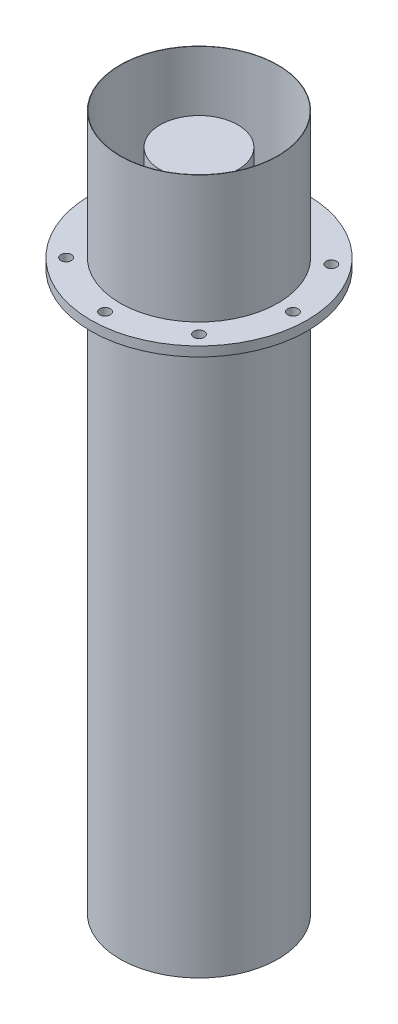
ISO-10303-21;
HEADER;
FILE_DESCRIPTION(('STEP AP214'),'2;1');
FILE_NAME('part.step','',(''),(''),'','','');
FILE_SCHEMA(('AUTOMOTIVE_DESIGN { 1 0 10303 214 1 1 1 1 }'));
ENDSEC;
DATA;
#1=APPLICATION_CONTEXT('core data for automotive mechanical design processes');
#2=APPLICATION_PROTOCOL_DEFINITION('international standard','automotive_design',2000,#1);
#3=PRODUCT_CONTEXT('',#1,'mechanical');
#4=PRODUCT('Part','Part','',(#3));
#5=PRODUCT_RELATED_PRODUCT_CATEGORY('part','',(#4));
#6=PRODUCT_DEFINITION_FORMATION('','',#4);
#7=PRODUCT_DEFINITION_CONTEXT('part definition',#1,'design');
#8=PRODUCT_DEFINITION('design','',#6,#7);
#9=PRODUCT_DEFINITION_SHAPE('','',#8);
#10=(LENGTH_UNIT() NAMED_UNIT(*) SI_UNIT(.MILLI.,.METRE.));
#11=(NAMED_UNIT(*) PLANE_ANGLE_UNIT() SI_UNIT($,.RADIAN.));
#12=(NAMED_UNIT(*) SI_UNIT($,.STERADIAN.) SOLID_ANGLE_UNIT());
#13=UNCERTAINTY_MEASURE_WITH_UNIT(LENGTH_MEASURE(1.E-05),#10,'distance_accuracy_value','');
#14=(GEOMETRIC_REPRESENTATION_CONTEXT(3) GLOBAL_UNCERTAINTY_ASSIGNED_CONTEXT((#13)) GLOBAL_UNIT_ASSIGNED_CONTEXT((#10,
#11,#12)) REPRESENTATION_CONTEXT('',''));
#15=CARTESIAN_POINT('',(0.,0.,0.));
#16=DIRECTION('',(0.,0.,1.));
#17=DIRECTION('',(1.,0.,0.));
#18=AXIS2_PLACEMENT_3D('',#15,#16,#17);
#19=CARTESIAN_POINT('',(0.,-81.6,0.));
#20=DIRECTION('',(0.,1.,0.));
#21=DIRECTION('',(0.,0.,1.));
#22=AXIS2_PLACEMENT_3D('',#19,#20,#21);
#23=CYLINDRICAL_SURFACE('',#22,22.5);
#24=CARTESIAN_POINT('',(0.,0.,0.));
#25=DIRECTION('',(0.,1.,0.));
#26=DIRECTION('',(0.,0.,1.));
#27=AXIS2_PLACEMENT_3D('',#24,#25,#26);
#28=CIRCLE('',#27,22.5);
#29=CARTESIAN_POINT('',(0.,0.,22.5));
#30=VERTEX_POINT('',#29);
#31=EDGE_CURVE('E12',#30,#30,#28,.T.);
#32=ORIENTED_EDGE('',*,*,#31,.T.);
#33=EDGE_LOOP('',(#32));
#34=FACE_BOUND('',#33,.T.);
#35=CARTESIAN_POINT('',(0.,175.4,0.));
#36=DIRECTION('',(0.,1.,0.));
#37=DIRECTION('',(0.,0.,1.));
#38=AXIS2_PLACEMENT_3D('',#35,#36,#37);
#39=CIRCLE('',#38,22.5);
#40=CARTESIAN_POINT('',(0.,175.4,22.5));
#41=VERTEX_POINT('',#40);
#42=EDGE_CURVE('E57',#41,#41,#39,.F.);
#43=ORIENTED_EDGE('',*,*,#42,.T.);
#44=EDGE_LOOP('',(#43));
#45=FACE_BOUND('',#44,.T.);
#46=ADVANCED_FACE('F53',(#34,#45),#23,.T.);
#47=CARTESIAN_POINT('',(0.,0.,0.));
#48=DIRECTION('',(0.,1.,0.));
#49=DIRECTION('',(0.,0.,1.));
#50=AXIS2_PLACEMENT_3D('',#47,#48,#49);
#51=PLANE('',#50);
#52=DIRECTION('',(-0.999986644437451,0.,-0.00516826341502603));
#53=VECTOR('',#52,1.);
#54=CARTESIAN_POINT('',(3.54748062860919,0.,6.21841736481043));
#55=LINE('',#54,#53);
#56=CARTESIAN_POINT('',(3.54748062860919,0.,6.21841736481042));
#57=VERTEX_POINT('',#56);
#58=CARTESIAN_POINT('',(-3.61156709495552,0.,6.18141702621396));
#59=VERTEX_POINT('',#58);
#60=EDGE_CURVE('E123',#57,#59,#55,.T.);
#61=ORIENTED_EDGE('',*,*,#60,.F.);
#62=DIRECTION('',(-0.504469169629588,0.,0.863429705820476));
#63=VECTOR('',#62,1.);
#64=CARTESIAN_POINT('',(7.15904772356471,0.,0.0370003385964624));
#65=LINE('',#64,#63);
#66=CARTESIAN_POINT('',(7.15904772356471,0.,0.0370003385964624));
#67=VERTEX_POINT('',#66);
#68=EDGE_CURVE('E160',#67,#57,#65,.T.);
#69=ORIENTED_EDGE('',*,*,#68,.F.);
#70=DIRECTION('',(0.495517474807863,0.,0.868597969235502));
#71=VECTOR('',#70,1.);
#72=CARTESIAN_POINT('',(3.61156709495552,0.,-6.18141702621396));
#73=LINE('',#72,#71);
#74=CARTESIAN_POINT('',(3.61156709495552,0.,-6.18141702621396));
#75=VERTEX_POINT('',#74);
#76=EDGE_CURVE('E181',#75,#67,#73,.T.);
#77=ORIENTED_EDGE('',*,*,#76,.F.);
#78=DIRECTION('',(0.999986644437451,0.,0.00516826341502615));
#79=VECTOR('',#78,1.);
#80=CARTESIAN_POINT('',(-3.54748062860919,0.,-6.21841736481043));
#81=LINE('',#80,#79);
#82=CARTESIAN_POINT('',(-3.54748062860919,0.,-6.21841736481043));
#83=VERTEX_POINT('',#82);
#84=EDGE_CURVE('E176',#83,#75,#81,.T.);
#85=ORIENTED_EDGE('',*,*,#84,.F.);
#86=DIRECTION('',(0.504469169629588,0.,-0.863429705820476));
#87=VECTOR('',#86,1.);
#88=CARTESIAN_POINT('',(-7.15904772356471,0.,-0.0370003385964647));
#89=LINE('',#88,#87);
#90=CARTESIAN_POINT('',(-7.15904772356471,0.,-0.0370003385964647));
#91=VERTEX_POINT('',#90);
#92=EDGE_CURVE('E171',#91,#83,#89,.T.);
#93=ORIENTED_EDGE('',*,*,#92,.F.);
#94=DIRECTION('',(-0.495517474807863,0.,-0.868597969235503));
#95=VECTOR('',#94,1.);
#96=CARTESIAN_POINT('',(-3.61156709495552,0.,6.18141702621396));
#97=LINE('',#96,#95);
#98=EDGE_CURVE('E128',#59,#91,#97,.T.);
#99=ORIENTED_EDGE('',*,*,#98,.F.);
#100=EDGE_LOOP('',(#61,#69,#77,#85,#93,#99));
#101=FACE_BOUND('',#100,.T.);
#102=ORIENTED_EDGE('',*,*,#31,.F.);
#103=EDGE_LOOP('',(#102));
#104=FACE_BOUND('',#103,.T.);
#105=ADVANCED_FACE('F55',(#101,#104),#51,.F.);
#106=CARTESIAN_POINT('',(0.,8.,0.));
#107=DIRECTION('',(0.,-1.,0.));
#108=DIRECTION('',(0.,0.,-1.));
#109=AXIS2_PLACEMENT_3D('',#106,#107,#108);
#110=PLANE('',#109);
#111=DIRECTION('',(-0.504469169629588,0.,0.863429705820476));
#112=VECTOR('',#111,1.);
#113=CARTESIAN_POINT('',(7.15904772356471,8.,0.0370003385964624));
#114=LINE('',#113,#112);
#115=CARTESIAN_POINT('',(7.15904772356471,8.,0.0370003385964624));
#116=VERTEX_POINT('',#115);
#117=CARTESIAN_POINT('',(3.54748062860919,8.,6.21841736481043));
#118=VERTEX_POINT('',#117);
#119=EDGE_CURVE('E144',#116,#118,#114,.T.);
#120=ORIENTED_EDGE('',*,*,#119,.T.);
#121=DIRECTION('',(-0.999986644437451,0.,-0.00516826341502603));
#122=VECTOR('',#121,1.);
#123=CARTESIAN_POINT('',(3.54748062860919,8.,6.21841736481043));
#124=LINE('',#123,#122);
#125=CARTESIAN_POINT('',(-3.61156709495552,8.,6.18141702621396));
#126=VERTEX_POINT('',#125);
#127=EDGE_CURVE('E120',#118,#126,#124,.T.);
#128=ORIENTED_EDGE('',*,*,#127,.T.);
#129=DIRECTION('',(-0.495517474807863,0.,-0.868597969235503));
#130=VECTOR('',#129,1.);
#131=CARTESIAN_POINT('',(-3.61156709495552,8.,6.18141702621396));
#132=LINE('',#131,#130);
#133=CARTESIAN_POINT('',(-7.15904772356471,8.,-0.0370003385964647));
#134=VERTEX_POINT('',#133);
#135=EDGE_CURVE('E131',#126,#134,#132,.T.);
#136=ORIENTED_EDGE('',*,*,#135,.T.);
#137=DIRECTION('',(0.504469169629588,0.,-0.863429705820476));
#138=VECTOR('',#137,1.);
#139=CARTESIAN_POINT('',(-7.15904772356471,8.,-0.0370003385964647));
#140=LINE('',#139,#138);
#141=CARTESIAN_POINT('',(-3.54748062860919,8.,-6.21841736481043));
#142=VERTEX_POINT('',#141);
#143=EDGE_CURVE('E138',#134,#142,#140,.T.);
#144=ORIENTED_EDGE('',*,*,#143,.T.);
#145=DIRECTION('',(0.999986644437451,0.,0.00516826341502615));
#146=VECTOR('',#145,1.);
#147=CARTESIAN_POINT('',(-3.54748062860919,8.,-6.21841736481043));
#148=LINE('',#147,#146);
#149=CARTESIAN_POINT('',(3.61156709495552,8.,-6.18141702621396));
#150=VERTEX_POINT('',#149);
#151=EDGE_CURVE('E152',#142,#150,#148,.T.);
#152=ORIENTED_EDGE('',*,*,#151,.T.);
#153=DIRECTION('',(0.495517474807863,0.,0.868597969235502));
#154=VECTOR('',#153,1.);
#155=CARTESIAN_POINT('',(3.61156709495552,8.,-6.18141702621396));
#156=LINE('',#155,#154);
#157=EDGE_CURVE('E156',#150,#116,#156,.T.);
#158=ORIENTED_EDGE('',*,*,#157,.T.);
#159=EDGE_LOOP('',(#120,#128,#136,#144,#152,#158));
#160=FACE_BOUND('',#159,.T.);
#161=DIRECTION('',(1.,0.,0.));
#162=VECTOR('',#161,1.);
#163=CARTESIAN_POINT('',(0.,8.,1.5));
#164=LINE('',#163,#162);
#165=CARTESIAN_POINT('',(-1.46969384566991,8.,1.5));
#166=VERTEX_POINT('',#165);
#167=CARTESIAN_POINT('',(1.46969384566991,8.,1.5));
#168=VERTEX_POINT('',#167);
#169=EDGE_CURVE('E159',#166,#168,#164,.T.);
#170=ORIENTED_EDGE('',*,*,#169,.T.);
#171=CARTESIAN_POINT('',(0.,8.,0.));
#172=DIRECTION('',(0.,-1.,0.));
#173=DIRECTION('',(0.,0.,-1.));
#174=AXIS2_PLACEMENT_3D('',#171,#172,#173);
#175=CIRCLE('',#174,2.1);
#176=EDGE_CURVE('E165',#168,#166,#175,.F.);
#177=ORIENTED_EDGE('',*,*,#176,.T.);
#178=EDGE_LOOP('',(#170,#177));
#179=FACE_BOUND('',#178,.T.);
#180=ADVANCED_FACE('F140',(#160,#179),#110,.T.);
#181=CARTESIAN_POINT('',(7.15904772356471,8.,0.0370003385964624));
#182=DIRECTION('',(0.863429705820476,0.,0.504469169629588));
#183=DIRECTION('',(0.504469169629588,0.,-0.863429705820476));
#184=AXIS2_PLACEMENT_3D('',#181,#182,#183);
#185=PLANE('',#184);
#186=ORIENTED_EDGE('',*,*,#68,.T.);
#187=DIRECTION('',(0.,-1.,0.));
#188=VECTOR('',#187,1.);
#189=CARTESIAN_POINT('',(3.54748062860919,8.,6.21841736481043));
#190=LINE('',#189,#188);
#191=EDGE_CURVE('E168',#118,#57,#190,.T.);
#192=ORIENTED_EDGE('',*,*,#191,.F.);
#193=ORIENTED_EDGE('',*,*,#119,.F.);
#194=DIRECTION('',(0.,-1.,0.));
#195=VECTOR('',#194,1.);
#196=CARTESIAN_POINT('',(7.15904772356471,8.,0.0370003385964624));
#197=LINE('',#196,#195);
#198=EDGE_CURVE('E164',#116,#67,#197,.T.);
#199=ORIENTED_EDGE('',*,*,#198,.T.);
#200=EDGE_LOOP('',(#186,#192,#193,#199));
#201=FACE_BOUND('',#200,.T.);
#202=ADVANCED_FACE('F341',(#201),#185,.F.);
#203=CARTESIAN_POINT('',(3.61156709495552,8.,-6.18141702621396));
#204=DIRECTION('',(0.868597969235503,0.,-0.495517474807863));
#205=DIRECTION('',(-0.495517474807863,0.,-0.868597969235503));
#206=AXIS2_PLACEMENT_3D('',#203,#204,#205);
#207=PLANE('',#206);
#208=ORIENTED_EDGE('',*,*,#76,.T.);
#209=ORIENTED_EDGE('',*,*,#198,.F.);
#210=ORIENTED_EDGE('',*,*,#157,.F.);
#211=DIRECTION('',(0.,-1.,0.));
#212=VECTOR('',#211,1.);
#213=CARTESIAN_POINT('',(3.61156709495552,8.,-6.18141702621396));
#214=LINE('',#213,#212);
#215=EDGE_CURVE('E180',#150,#75,#214,.T.);
#216=ORIENTED_EDGE('',*,*,#215,.T.);
#217=EDGE_LOOP('',(#208,#209,#210,#216));
#218=FACE_BOUND('',#217,.T.);
#219=ADVANCED_FACE('F342',(#218),#207,.F.);
#220=CARTESIAN_POINT('',(-3.54748062860919,8.,-6.21841736481043));
#221=DIRECTION('',(0.00516826341502615,0.,-0.999986644437451));
#222=DIRECTION('',(-0.999986644437451,0.,-0.00516826341502615));
#223=AXIS2_PLACEMENT_3D('',#220,#221,#222);
#224=PLANE('',#223);
#225=ORIENTED_EDGE('',*,*,#84,.T.);
#226=ORIENTED_EDGE('',*,*,#215,.F.);
#227=ORIENTED_EDGE('',*,*,#151,.F.);
#228=DIRECTION('',(0.,-1.,0.));
#229=VECTOR('',#228,1.);
#230=CARTESIAN_POINT('',(-3.54748062860919,8.,-6.21841736481043));
#231=LINE('',#230,#229);
#232=EDGE_CURVE('E175',#142,#83,#231,.T.);
#233=ORIENTED_EDGE('',*,*,#232,.T.);
#234=EDGE_LOOP('',(#225,#226,#227,#233));
#235=FACE_BOUND('',#234,.T.);
#236=ADVANCED_FACE('F345',(#235),#224,.F.);
#237=CARTESIAN_POINT('',(-7.15904772356471,8.,-0.0370003385964647));
#238=DIRECTION('',(-0.863429705820476,0.,-0.504469169629588));
#239=DIRECTION('',(-0.504469169629588,0.,0.863429705820476));
#240=AXIS2_PLACEMENT_3D('',#237,#238,#239);
#241=PLANE('',#240);
#242=ORIENTED_EDGE('',*,*,#92,.T.);
#243=ORIENTED_EDGE('',*,*,#232,.F.);
#244=ORIENTED_EDGE('',*,*,#143,.F.);
#245=DIRECTION('',(0.,-1.,0.));
#246=VECTOR('',#245,1.);
#247=CARTESIAN_POINT('',(-7.15904772356471,8.,-0.0370003385964647));
#248=LINE('',#247,#246);
#249=EDGE_CURVE('E133',#134,#91,#248,.T.);
#250=ORIENTED_EDGE('',*,*,#249,.T.);
#251=EDGE_LOOP('',(#242,#243,#244,#250));
#252=FACE_BOUND('',#251,.T.);
#253=ADVANCED_FACE('F349',(#252),#241,.F.);
#254=CARTESIAN_POINT('',(-3.61156709495552,8.,6.18141702621396));
#255=DIRECTION('',(-0.868597969235503,0.,0.495517474807863));
#256=DIRECTION('',(0.495517474807863,0.,0.868597969235503));
#257=AXIS2_PLACEMENT_3D('',#254,#255,#256);
#258=PLANE('',#257);
#259=ORIENTED_EDGE('',*,*,#98,.T.);
#260=ORIENTED_EDGE('',*,*,#249,.F.);
#261=ORIENTED_EDGE('',*,*,#135,.F.);
#262=DIRECTION('',(0.,-1.,0.));
#263=VECTOR('',#262,1.);
#264=CARTESIAN_POINT('',(-3.61156709495552,8.,6.18141702621396));
#265=LINE('',#264,#263);
#266=EDGE_CURVE('E115',#126,#59,#265,.T.);
#267=ORIENTED_EDGE('',*,*,#266,.T.);
#268=EDGE_LOOP('',(#259,#260,#261,#267));
#269=FACE_BOUND('',#268,.T.);
#270=ADVANCED_FACE('F132',(#269),#258,.F.);
#271=CARTESIAN_POINT('',(3.54748062860919,8.,6.21841736481043));
#272=DIRECTION('',(-0.00516826341502603,0.,0.999986644437451));
#273=DIRECTION('',(0.999986644437451,0.,0.00516826341502603));
#274=AXIS2_PLACEMENT_3D('',#271,#272,#273);
#275=PLANE('',#274);
#276=ORIENTED_EDGE('',*,*,#60,.T.);
#277=ORIENTED_EDGE('',*,*,#266,.F.);
#278=ORIENTED_EDGE('',*,*,#127,.F.);
#279=ORIENTED_EDGE('',*,*,#191,.T.);
#280=EDGE_LOOP('',(#276,#277,#278,#279));
#281=FACE_BOUND('',#280,.T.);
#282=ADVANCED_FACE('F117',(#281),#275,.F.);
#283=CARTESIAN_POINT('',(0.,10.,0.));
#284=DIRECTION('',(0.,-1.,0.));
#285=DIRECTION('',(0.,0.,-1.));
#286=AXIS2_PLACEMENT_3D('',#283,#284,#285);
#287=PLANE('',#286);
#288=DIRECTION('',(-1.,0.,0.));
#289=VECTOR('',#288,1.);
#290=CARTESIAN_POINT('',(0.,10.,1.5));
#291=LINE('',#290,#289);
#292=CARTESIAN_POINT('',(1.46969384566991,10.,1.5));
#293=VERTEX_POINT('',#292);
#294=CARTESIAN_POINT('',(-1.46969384566991,10.,1.5));
#295=VERTEX_POINT('',#294);
#296=EDGE_CURVE('E73',#293,#295,#291,.T.);
#297=ORIENTED_EDGE('',*,*,#296,.T.);
#298=CARTESIAN_POINT('',(0.,10.,0.));
#299=DIRECTION('',(0.,-1.,0.));
#300=DIRECTION('',(0.,0.,-1.));
#301=AXIS2_PLACEMENT_3D('',#298,#299,#300);
#302=CIRCLE('',#301,2.1);
#303=EDGE_CURVE('E200',#295,#293,#302,.T.);
#304=ORIENTED_EDGE('',*,*,#303,.T.);
#305=EDGE_LOOP('',(#297,#304));
#306=FACE_BOUND('',#305,.T.);
#307=ADVANCED_FACE('F358',(#306),#287,.T.);
#308=CARTESIAN_POINT('',(0.,10.,0.));
#309=DIRECTION('',(0.,-1.,0.));
#310=DIRECTION('',(0.,0.,-1.));
#311=AXIS2_PLACEMENT_3D('',#308,#309,#310);
#312=CYLINDRICAL_SURFACE('',#311,2.1);
#313=ORIENTED_EDGE('',*,*,#176,.F.);
#314=DIRECTION('',(0.,-1.,0.));
#315=VECTOR('',#314,1.);
#316=CARTESIAN_POINT('',(1.46969384566991,10.,1.5));
#317=LINE('',#316,#315);
#318=EDGE_CURVE('E64',#293,#168,#317,.T.);
#319=ORIENTED_EDGE('',*,*,#318,.F.);
#320=ORIENTED_EDGE('',*,*,#303,.F.);
#321=DIRECTION('',(0.,-1.,0.));
#322=VECTOR('',#321,1.);
#323=CARTESIAN_POINT('',(-1.46969384566991,10.,1.5));
#324=LINE('',#323,#322);
#325=EDGE_CURVE('E204',#295,#166,#324,.T.);
#326=ORIENTED_EDGE('',*,*,#325,.T.);
#327=EDGE_LOOP('',(#313,#319,#320,#326));
#328=FACE_BOUND('',#327,.T.);
#329=ADVANCED_FACE('F328',(#328),#312,.F.);
#330=CARTESIAN_POINT('',(0.,10.,1.5));
#331=DIRECTION('',(0.,0.,1.));
#332=DIRECTION('',(1.,0.,0.));
#333=AXIS2_PLACEMENT_3D('',#330,#331,#332);
#334=PLANE('',#333);
#335=ORIENTED_EDGE('',*,*,#169,.F.);
#336=ORIENTED_EDGE('',*,*,#325,.F.);
#337=ORIENTED_EDGE('',*,*,#296,.F.);
#338=ORIENTED_EDGE('',*,*,#318,.T.);
#339=EDGE_LOOP('',(#335,#336,#337,#338));
#340=FACE_BOUND('',#339,.T.);
#341=ADVANCED_FACE('F317',(#340),#334,.F.);
#342=CARTESIAN_POINT('',(0.,175.4,0.));
#343=DIRECTION('',(0.,1.,0.));
#344=DIRECTION('',(0.,0.,1.));
#345=AXIS2_PLACEMENT_3D('',#342,#343,#344);
#346=CYLINDRICAL_SURFACE('',#345,34.);
#347=CARTESIAN_POINT('',(0.,175.4,0.));
#348=DIRECTION('',(0.,1.,0.));
#349=DIRECTION('',(0.,0.,1.));
#350=AXIS2_PLACEMENT_3D('',#347,#348,#349);
#351=CIRCLE('',#350,34.);
#352=CARTESIAN_POINT('',(0.,175.4,34.));
#353=VERTEX_POINT('',#352);
#354=EDGE_CURVE('E223',#353,#353,#351,.T.);
#355=ORIENTED_EDGE('',*,*,#354,.T.);
#356=EDGE_LOOP('',(#355));
#357=FACE_BOUND('',#356,.T.);
#358=CARTESIAN_POINT('',(0.,178.4,0.));
#359=DIRECTION('',(0.,1.,0.));
#360=DIRECTION('',(0.,0.,1.));
#361=AXIS2_PLACEMENT_3D('',#358,#359,#360);
#362=CIRCLE('',#361,34.);
#363=CARTESIAN_POINT('',(0.,178.4,34.));
#364=VERTEX_POINT('',#363);
#365=EDGE_CURVE('E219',#364,#364,#362,.T.);
#366=ORIENTED_EDGE('',*,*,#365,.F.);
#367=EDGE_LOOP('',(#366));
#368=FACE_BOUND('',#367,.T.);
#369=ADVANCED_FACE('F315',(#357,#368),#346,.T.);
#370=CARTESIAN_POINT('',(0.,175.4,0.));
#371=DIRECTION('',(0.,1.,0.));
#372=DIRECTION('',(0.,0.,1.));
#373=AXIS2_PLACEMENT_3D('',#370,#371,#372);
#374=PLANE('',#373);
#375=ORIENTED_EDGE('',*,*,#42,.F.);
#376=EDGE_LOOP('',(#375));
#377=FACE_BOUND('',#376,.T.);
#378=CARTESIAN_POINT('',(29.5,175.4,0.));
#379=DIRECTION('',(0.,1.,0.));
#380=DIRECTION('',(0.,0.,-1.));
#381=AXIS2_PLACEMENT_3D('',#378,#379,#380);
#382=CIRCLE('',#381,1.65);
#383=CARTESIAN_POINT('',(29.5,175.4,-1.65));
#384=VERTEX_POINT('',#383);
#385=EDGE_CURVE('E272',#384,#384,#382,.T.);
#386=ORIENTED_EDGE('',*,*,#385,.T.);
#387=EDGE_LOOP('',(#386));
#388=FACE_BOUND('',#387,.T.);
#389=CARTESIAN_POINT('',(22.5983110720098,175.4,-18.9622344857529));
#390=DIRECTION('',(0.,1.,0.));
#391=DIRECTION('',(0.,0.,-1.));
#392=AXIS2_PLACEMENT_3D('',#389,#390,#391);
#393=CIRCLE('',#392,1.65);
#394=CARTESIAN_POINT('',(22.5983110720098,175.4,-20.6122344857529));
#395=VERTEX_POINT('',#394);
#396=EDGE_CURVE('E264',#395,#395,#393,.T.);
#397=ORIENTED_EDGE('',*,*,#396,.T.);
#398=EDGE_LOOP('',(#397));
#399=FACE_BOUND('',#398,.T.);
#400=CARTESIAN_POINT('',(20.8596500450031,175.4,20.8596500450032));
#401=DIRECTION('',(0.,1.,0.));
#402=DIRECTION('',(0.,0.,-1.));
#403=AXIS2_PLACEMENT_3D('',#400,#401,#402);
#404=CIRCLE('',#403,1.65);
#405=CARTESIAN_POINT('',(20.8596500450031,175.4,19.2096500450032));
#406=VERTEX_POINT('',#405);
#407=EDGE_CURVE('E256',#406,#406,#404,.T.);
#408=ORIENTED_EDGE('',*,*,#407,.T.);
#409=EDGE_LOOP('',(#408));
#410=FACE_BOUND('',#409,.T.);
#411=CARTESIAN_POINT('',(0.,175.4,29.5));
#412=DIRECTION('',(0.,1.,0.));
#413=DIRECTION('',(0.,0.,1.));
#414=AXIS2_PLACEMENT_3D('',#411,#412,#413);
#415=CIRCLE('',#414,1.65);
#416=CARTESIAN_POINT('',(0.,175.4,31.15));
#417=VERTEX_POINT('',#416);
#418=EDGE_CURVE('E248',#417,#417,#415,.T.);
#419=ORIENTED_EDGE('',*,*,#418,.T.);
#420=EDGE_LOOP('',(#419));
#421=FACE_BOUND('',#420,.T.);
#422=CARTESIAN_POINT('',(-20.8596500450031,175.4,20.8596500450032));
#423=DIRECTION('',(0.,1.,0.));
#424=DIRECTION('',(0.,0.,1.));
#425=AXIS2_PLACEMENT_3D('',#422,#423,#424);
#426=CIRCLE('',#425,1.65);
#427=CARTESIAN_POINT('',(-20.8596500450031,175.4,22.5096500450032));
#428=VERTEX_POINT('',#427);
#429=EDGE_CURVE('E240',#428,#428,#426,.T.);
#430=ORIENTED_EDGE('',*,*,#429,.T.);
#431=EDGE_LOOP('',(#430));
#432=FACE_BOUND('',#431,.T.);
#433=CARTESIAN_POINT('',(-29.5,175.4,0.));
#434=DIRECTION('',(0.,1.,0.));
#435=DIRECTION('',(0.,0.,1.));
#436=AXIS2_PLACEMENT_3D('',#433,#434,#435);
#437=CIRCLE('',#436,1.65);
#438=CARTESIAN_POINT('',(-29.5,175.4,1.65));
#439=VERTEX_POINT('',#438);
#440=EDGE_CURVE('E232',#439,#439,#437,.T.);
#441=ORIENTED_EDGE('',*,*,#440,.T.);
#442=EDGE_LOOP('',(#441));
#443=FACE_BOUND('',#442,.T.);
#444=CARTESIAN_POINT('',(-22.5983110720098,175.4,-18.9622344857529));
#445=DIRECTION('',(0.,1.,0.));
#446=DIRECTION('',(0.,0.,1.));
#447=AXIS2_PLACEMENT_3D('',#444,#445,#446);
#448=CIRCLE('',#447,1.65);
#449=CARTESIAN_POINT('',(-22.5983110720098,175.4,-17.3122344857529));
#450=VERTEX_POINT('',#449);
#451=EDGE_CURVE('E224',#450,#450,#448,.T.);
#452=ORIENTED_EDGE('',*,*,#451,.T.);
#453=EDGE_LOOP('',(#452));
#454=FACE_BOUND('',#453,.T.);
#455=ORIENTED_EDGE('',*,*,#354,.F.);
#456=EDGE_LOOP('',(#455));
#457=FACE_BOUND('',#456,.T.);
#458=ADVANCED_FACE('F284',(#377,#388,#399,#410,#421,#432,#443,#454,#457),#374,.F.);
#459=CARTESIAN_POINT('',(-22.5983110720098,175.4,-18.9622344857529));
#460=DIRECTION('',(0.,1.,0.));
#461=DIRECTION('',(0.,0.,1.));
#462=AXIS2_PLACEMENT_3D('',#459,#460,#461);
#463=CYLINDRICAL_SURFACE('',#462,1.65);
#464=ORIENTED_EDGE('',*,*,#451,.F.);
#465=EDGE_LOOP('',(#464));
#466=FACE_BOUND('',#465,.T.);
#467=CARTESIAN_POINT('',(-22.5983110720098,178.4,-18.9622344857529));
#468=DIRECTION('',(0.,1.,0.));
#469=DIRECTION('',(0.,0.,1.));
#470=AXIS2_PLACEMENT_3D('',#467,#468,#469);
#471=CIRCLE('',#470,1.65);
#472=CARTESIAN_POINT('',(-22.5983110720098,178.4,-17.3122344857529));
#473=VERTEX_POINT('',#472);
#474=EDGE_CURVE('E228',#473,#473,#471,.T.);
#475=ORIENTED_EDGE('',*,*,#474,.T.);
#476=EDGE_LOOP('',(#475));
#477=FACE_BOUND('',#476,.T.);
#478=ADVANCED_FACE('F324',(#466,#477),#463,.F.);
#479=CARTESIAN_POINT('',(-29.5,175.4,0.));
#480=DIRECTION('',(0.,1.,0.));
#481=DIRECTION('',(0.,0.,1.));
#482=AXIS2_PLACEMENT_3D('',#479,#480,#481);
#483=CYLINDRICAL_SURFACE('',#482,1.65);
#484=ORIENTED_EDGE('',*,*,#440,.F.);
#485=EDGE_LOOP('',(#484));
#486=FACE_BOUND('',#485,.T.);
#487=CARTESIAN_POINT('',(-29.5,178.4,0.));
#488=DIRECTION('',(0.,1.,0.));
#489=DIRECTION('',(0.,0.,1.));
#490=AXIS2_PLACEMENT_3D('',#487,#488,#489);
#491=CIRCLE('',#490,1.65);
#492=CARTESIAN_POINT('',(-29.5,178.4,1.65));
#493=VERTEX_POINT('',#492);
#494=EDGE_CURVE('E236',#493,#493,#491,.T.);
#495=ORIENTED_EDGE('',*,*,#494,.T.);
#496=EDGE_LOOP('',(#495));
#497=FACE_BOUND('',#496,.T.);
#498=ADVANCED_FACE('F416',(#486,#497),#483,.F.);
#499=CARTESIAN_POINT('',(-20.8596500450031,175.4,20.8596500450032));
#500=DIRECTION('',(0.,1.,0.));
#501=DIRECTION('',(0.,0.,1.));
#502=AXIS2_PLACEMENT_3D('',#499,#500,#501);
#503=CYLINDRICAL_SURFACE('',#502,1.65);
#504=ORIENTED_EDGE('',*,*,#429,.F.);
#505=EDGE_LOOP('',(#504));
#506=FACE_BOUND('',#505,.T.);
#507=CARTESIAN_POINT('',(-20.8596500450031,178.4,20.8596500450032));
#508=DIRECTION('',(0.,1.,0.));
#509=DIRECTION('',(0.,0.,1.));
#510=AXIS2_PLACEMENT_3D('',#507,#508,#509);
#511=CIRCLE('',#510,1.65);
#512=CARTESIAN_POINT('',(-20.8596500450031,178.4,22.5096500450032));
#513=VERTEX_POINT('',#512);
#514=EDGE_CURVE('E244',#513,#513,#511,.T.);
#515=ORIENTED_EDGE('',*,*,#514,.T.);
#516=EDGE_LOOP('',(#515));
#517=FACE_BOUND('',#516,.T.);
#518=ADVANCED_FACE('F425',(#506,#517),#503,.F.);
#519=CARTESIAN_POINT('',(0.,175.4,29.5));
#520=DIRECTION('',(0.,1.,0.));
#521=DIRECTION('',(0.,0.,1.));
#522=AXIS2_PLACEMENT_3D('',#519,#520,#521);
#523=CYLINDRICAL_SURFACE('',#522,1.65);
#524=ORIENTED_EDGE('',*,*,#418,.F.);
#525=EDGE_LOOP('',(#524));
#526=FACE_BOUND('',#525,.T.);
#527=CARTESIAN_POINT('',(0.,178.4,29.5));
#528=DIRECTION('',(0.,1.,0.));
#529=DIRECTION('',(0.,0.,1.));
#530=AXIS2_PLACEMENT_3D('',#527,#528,#529);
#531=CIRCLE('',#530,1.65);
#532=CARTESIAN_POINT('',(0.,178.4,31.15));
#533=VERTEX_POINT('',#532);
#534=EDGE_CURVE('E252',#533,#533,#531,.T.);
#535=ORIENTED_EDGE('',*,*,#534,.T.);
#536=EDGE_LOOP('',(#535));
#537=FACE_BOUND('',#536,.T.);
#538=ADVANCED_FACE('F434',(#526,#537),#523,.F.);
#539=CARTESIAN_POINT('',(20.8596500450031,175.4,20.8596500450032));
#540=DIRECTION('',(0.,1.,0.));
#541=DIRECTION('',(0.,0.,1.));
#542=AXIS2_PLACEMENT_3D('',#539,#540,#541);
#543=CYLINDRICAL_SURFACE('',#542,1.65);
#544=ORIENTED_EDGE('',*,*,#407,.F.);
#545=EDGE_LOOP('',(#544));
#546=FACE_BOUND('',#545,.T.);
#547=CARTESIAN_POINT('',(20.8596500450031,178.4,20.8596500450032));
#548=DIRECTION('',(0.,1.,0.));
#549=DIRECTION('',(0.,0.,-1.));
#550=AXIS2_PLACEMENT_3D('',#547,#548,#549);
#551=CIRCLE('',#550,1.65);
#552=CARTESIAN_POINT('',(20.8596500450031,178.4,19.2096500450032));
#553=VERTEX_POINT('',#552);
#554=EDGE_CURVE('E260',#553,#553,#551,.T.);
#555=ORIENTED_EDGE('',*,*,#554,.T.);
#556=EDGE_LOOP('',(#555));
#557=FACE_BOUND('',#556,.T.);
#558=ADVANCED_FACE('F443',(#546,#557),#543,.F.);
#559=CARTESIAN_POINT('',(22.5983110720098,175.4,-18.9622344857529));
#560=DIRECTION('',(0.,1.,0.));
#561=DIRECTION('',(0.,0.,1.));
#562=AXIS2_PLACEMENT_3D('',#559,#560,#561);
#563=CYLINDRICAL_SURFACE('',#562,1.65);
#564=ORIENTED_EDGE('',*,*,#396,.F.);
#565=EDGE_LOOP('',(#564));
#566=FACE_BOUND('',#565,.T.);
#567=CARTESIAN_POINT('',(22.5983110720098,178.4,-18.9622344857529));
#568=DIRECTION('',(0.,1.,0.));
#569=DIRECTION('',(0.,0.,-1.));
#570=AXIS2_PLACEMENT_3D('',#567,#568,#569);
#571=CIRCLE('',#570,1.65);
#572=CARTESIAN_POINT('',(22.5983110720098,178.4,-20.6122344857529));
#573=VERTEX_POINT('',#572);
#574=EDGE_CURVE('E268',#573,#573,#571,.T.);
#575=ORIENTED_EDGE('',*,*,#574,.T.);
#576=EDGE_LOOP('',(#575));
#577=FACE_BOUND('',#576,.T.);
#578=ADVANCED_FACE('F291',(#566,#577),#563,.F.);
#579=CARTESIAN_POINT('',(29.5,175.4,0.));
#580=DIRECTION('',(0.,1.,0.));
#581=DIRECTION('',(0.,0.,1.));
#582=AXIS2_PLACEMENT_3D('',#579,#580,#581);
#583=CYLINDRICAL_SURFACE('',#582,1.65);
#584=ORIENTED_EDGE('',*,*,#385,.F.);
#585=EDGE_LOOP('',(#584));
#586=FACE_BOUND('',#585,.T.);
#587=CARTESIAN_POINT('',(29.5,178.4,0.));
#588=DIRECTION('',(0.,1.,0.));
#589=DIRECTION('',(0.,0.,-1.));
#590=AXIS2_PLACEMENT_3D('',#587,#588,#589);
#591=CIRCLE('',#590,1.65);
#592=CARTESIAN_POINT('',(29.5,178.4,-1.65));
#593=VERTEX_POINT('',#592);
#594=EDGE_CURVE('E276',#593,#593,#591,.T.);
#595=ORIENTED_EDGE('',*,*,#594,.T.);
#596=EDGE_LOOP('',(#595));
#597=FACE_BOUND('',#596,.T.);
#598=ADVANCED_FACE('F287',(#586,#597),#583,.F.);
#599=CARTESIAN_POINT('',(0.,208.4,0.));
#600=DIRECTION('',(0.,1.,0.));
#601=DIRECTION('',(0.,0.,1.));
#602=AXIS2_PLACEMENT_3D('',#599,#600,#601);
#603=PLANE('',#602);
#604=CARTESIAN_POINT('',(0.,208.4,0.));
#605=DIRECTION('',(0.,1.,0.));
#606=DIRECTION('',(0.,0.,1.));
#607=AXIS2_PLACEMENT_3D('',#604,#605,#606);
#608=CIRCLE('',#607,12.2);
#609=CARTESIAN_POINT('',(0.,208.4,12.2));
#610=VERTEX_POINT('',#609);
#611=EDGE_CURVE('E212',#610,#610,#608,.T.);
#612=ORIENTED_EDGE('',*,*,#611,.T.);
#613=EDGE_LOOP('',(#612));
#614=FACE_BOUND('',#613,.T.);
#615=ADVANCED_FACE('F290',(#614),#603,.T.);
#616=CARTESIAN_POINT('',(0.,178.4,0.));
#617=DIRECTION('',(0.,1.,0.));
#618=DIRECTION('',(0.,0.,1.));
#619=AXIS2_PLACEMENT_3D('',#616,#617,#618);
#620=CYLINDRICAL_SURFACE('',#619,12.2);
#621=CARTESIAN_POINT('',(0.,178.4,0.));
#622=DIRECTION('',(0.,1.,0.));
#623=DIRECTION('',(0.,0.,1.));
#624=AXIS2_PLACEMENT_3D('',#621,#622,#623);
#625=CIRCLE('',#624,12.2);
#626=CARTESIAN_POINT('',(0.,178.4,12.2));
#627=VERTEX_POINT('',#626);
#628=EDGE_CURVE('E148',#627,#627,#625,.T.);
#629=ORIENTED_EDGE('',*,*,#628,.T.);
#630=EDGE_LOOP('',(#629));
#631=FACE_BOUND('',#630,.T.);
#632=ORIENTED_EDGE('',*,*,#611,.F.);
#633=EDGE_LOOP('',(#632));
#634=FACE_BOUND('',#633,.T.);
#635=ADVANCED_FACE('F298',(#631,#634),#620,.T.);
#636=CARTESIAN_POINT('',(0.,178.4,0.));
#637=DIRECTION('',(0.,1.,0.));
#638=DIRECTION('',(0.,0.,1.));
#639=AXIS2_PLACEMENT_3D('',#636,#637,#638);
#640=PLANE('',#639);
#641=ORIENTED_EDGE('',*,*,#628,.F.);
#642=EDGE_LOOP('',(#641));
#643=FACE_BOUND('',#642,.T.);
#644=ORIENTED_EDGE('',*,*,#594,.F.);
#645=EDGE_LOOP('',(#644));
#646=FACE_BOUND('',#645,.T.);
#647=ORIENTED_EDGE('',*,*,#574,.F.);
#648=EDGE_LOOP('',(#647));
#649=FACE_BOUND('',#648,.T.);
#650=ORIENTED_EDGE('',*,*,#554,.F.);
#651=EDGE_LOOP('',(#650));
#652=FACE_BOUND('',#651,.T.);
#653=ORIENTED_EDGE('',*,*,#534,.F.);
#654=EDGE_LOOP('',(#653));
#655=FACE_BOUND('',#654,.T.);
#656=ORIENTED_EDGE('',*,*,#514,.F.);
#657=EDGE_LOOP('',(#656));
#658=FACE_BOUND('',#657,.T.);
#659=ORIENTED_EDGE('',*,*,#494,.F.);
#660=EDGE_LOOP('',(#659));
#661=FACE_BOUND('',#660,.T.);
#662=ORIENTED_EDGE('',*,*,#474,.F.);
#663=EDGE_LOOP('',(#662));
#664=FACE_BOUND('',#663,.T.);
#665=ORIENTED_EDGE('',*,*,#365,.T.);
#666=EDGE_LOOP('',(#665));
#667=FACE_BOUND('',#666,.T.);
#668=ADVANCED_FACE('F295',(#643,#646,#649,#652,#655,#658,#661,#664,#667),#640,.T.);
#669=CLOSED_SHELL('',(#46,#105,#180,#202,#219,#236,#253,#270,#282,#307,#329,#341,#369,#458,#478,
#498,#518,#538,#558,#578,#598,#615,#635,#668));
#670=MANIFOLD_SOLID_BREP('B2',#669);
#671=CARTESIAN_POINT('',(0.,218.4,0.));
#672=DIRECTION('',(0.,1.,0.));
#673=DIRECTION('',(0.,0.,1.));
#674=AXIS2_PLACEMENT_3D('',#671,#672,#673);
#675=PLANE('',#674);
#676=CARTESIAN_POINT('',(0.,218.4,0.));
#677=DIRECTION('',(0.,1.,0.));
#678=DIRECTION('',(0.,0.,1.));
#679=AXIS2_PLACEMENT_3D('',#676,#677,#678);
#680=CIRCLE('',#679,24.7);
#681=CARTESIAN_POINT('',(0.,218.4,24.7));
#682=VERTEX_POINT('',#681);
#683=EDGE_CURVE('E593',#682,#682,#680,.T.);
#684=ORIENTED_EDGE('',*,*,#683,.F.);
#685=EDGE_LOOP('',(#684));
#686=FACE_BOUND('',#685,.T.);
#687=CARTESIAN_POINT('',(0.,218.4,0.));
#688=DIRECTION('',(0.,1.,0.));
#689=DIRECTION('',(0.,0.,1.));
#690=AXIS2_PLACEMENT_3D('',#687,#688,#689);
#691=CIRCLE('',#690,24.8);
#692=CARTESIAN_POINT('',(0.,218.4,24.8));
#693=VERTEX_POINT('',#692);
#694=EDGE_CURVE('E52',#693,#693,#691,.T.);
#695=ORIENTED_EDGE('',*,*,#694,.T.);
#696=EDGE_LOOP('',(#695));
#697=FACE_BOUND('',#696,.T.);
#698=ADVANCED_FACE('F579',(#686,#697),#675,.T.);
#699=CARTESIAN_POINT('',(0.,218.4,0.));
#700=DIRECTION('',(0.,-1.,0.));
#701=DIRECTION('',(0.,0.,-1.));
#702=AXIS2_PLACEMENT_3D('',#699,#700,#701);
#703=CYLINDRICAL_SURFACE('',#702,24.8);
#704=ORIENTED_EDGE('',*,*,#694,.F.);
#705=EDGE_LOOP('',(#704));
#706=FACE_BOUND('',#705,.T.);
#707=CARTESIAN_POINT('',(0.,0.,0.));
#708=DIRECTION('',(0.,1.,0.));
#709=DIRECTION('',(0.,0.,1.));
#710=AXIS2_PLACEMENT_3D('',#707,#708,#709);
#711=CIRCLE('',#710,24.8);
#712=CARTESIAN_POINT('',(0.,0.,24.8));
#713=VERTEX_POINT('',#712);
#714=EDGE_CURVE('E587',#713,#713,#711,.T.);
#715=ORIENTED_EDGE('',*,*,#714,.T.);
#716=EDGE_LOOP('',(#715));
#717=FACE_BOUND('',#716,.T.);
#718=ADVANCED_FACE('F581',(#706,#717),#703,.T.);
#719=CARTESIAN_POINT('',(0.,0.,0.));
#720=DIRECTION('',(0.,1.,0.));
#721=DIRECTION('',(0.,0.,1.));
#722=AXIS2_PLACEMENT_3D('',#719,#720,#721);
#723=PLANE('',#722);
#724=CARTESIAN_POINT('',(0.,0.,0.));
#725=DIRECTION('',(0.,1.,0.));
#726=DIRECTION('',(0.,0.,1.));
#727=AXIS2_PLACEMENT_3D('',#724,#725,#726);
#728=CIRCLE('',#727,24.7);
#729=CARTESIAN_POINT('',(0.,0.,24.7));
#730=VERTEX_POINT('',#729);
#731=EDGE_CURVE('E583',#730,#730,#728,.T.);
#732=ORIENTED_EDGE('',*,*,#731,.T.);
#733=EDGE_LOOP('',(#732));
#734=FACE_BOUND('',#733,.T.);
#735=ORIENTED_EDGE('',*,*,#714,.F.);
#736=EDGE_LOOP('',(#735));
#737=FACE_BOUND('',#736,.T.);
#738=ADVANCED_FACE('F600',(#734,#737),#723,.F.);
#739=CARTESIAN_POINT('',(0.,-81.6,0.));
#740=DIRECTION('',(0.,1.,0.));
#741=DIRECTION('',(0.,0.,1.));
#742=AXIS2_PLACEMENT_3D('',#739,#740,#741);
#743=CYLINDRICAL_SURFACE('',#742,24.7);
#744=ORIENTED_EDGE('',*,*,#683,.T.);
#745=EDGE_LOOP('',(#744));
#746=FACE_BOUND('',#745,.T.);
#747=ORIENTED_EDGE('',*,*,#731,.F.);
#748=EDGE_LOOP('',(#747));
#749=FACE_BOUND('',#748,.T.);
#750=ADVANCED_FACE('F603',(#746,#749),#743,.F.);
#751=CLOSED_SHELL('',(#698,#718,#738,#750));
#752=MANIFOLD_SOLID_BREP('B6',#751);
#753=ADVANCED_BREP_SHAPE_REPRESENTATION('',(#18,#670,#752),#14);
#754=SHAPE_DEFINITION_REPRESENTATION(#9,#753);
ENDSEC;
END-ISO-10303-21;
